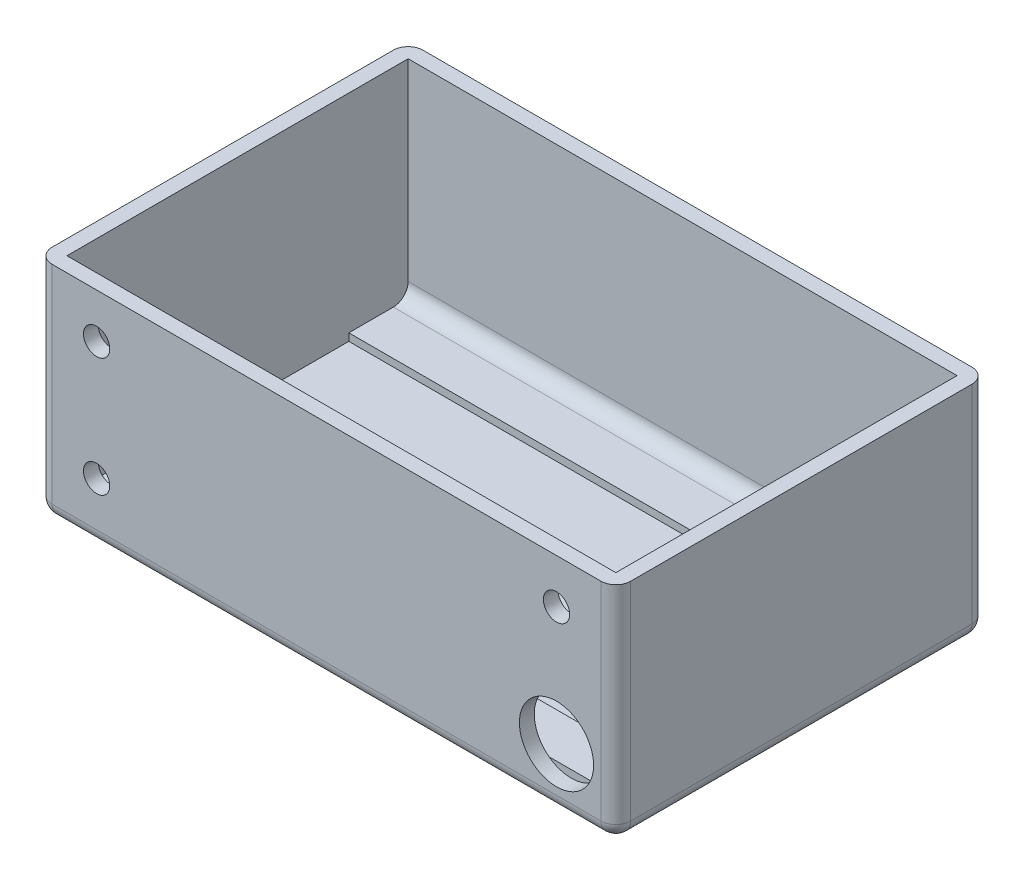
ISO-10303-21;
HEADER;
FILE_DESCRIPTION(('STEP AP214'),'2;1');
FILE_NAME('part.step','',(''),(''),'','','');
FILE_SCHEMA(('AUTOMOTIVE_DESIGN { 1 0 10303 214 1 1 1 1 }'));
ENDSEC;
DATA;
#1=APPLICATION_CONTEXT('core data for automotive mechanical design processes');
#2=APPLICATION_PROTOCOL_DEFINITION('international standard','automotive_design',2000,#1);
#3=PRODUCT_CONTEXT('',#1,'mechanical');
#4=PRODUCT('Part','Part','',(#3));
#5=PRODUCT_RELATED_PRODUCT_CATEGORY('part','',(#4));
#6=PRODUCT_DEFINITION_FORMATION('','',#4);
#7=PRODUCT_DEFINITION_CONTEXT('part definition',#1,'design');
#8=PRODUCT_DEFINITION('design','',#6,#7);
#9=PRODUCT_DEFINITION_SHAPE('','',#8);
#10=(LENGTH_UNIT() NAMED_UNIT(*) SI_UNIT(.MILLI.,.METRE.));
#11=(NAMED_UNIT(*) PLANE_ANGLE_UNIT() SI_UNIT($,.RADIAN.));
#12=(NAMED_UNIT(*) SI_UNIT($,.STERADIAN.) SOLID_ANGLE_UNIT());
#13=UNCERTAINTY_MEASURE_WITH_UNIT(LENGTH_MEASURE(1.E-05),#10,'distance_accuracy_value','');
#14=(GEOMETRIC_REPRESENTATION_CONTEXT(3) GLOBAL_UNCERTAINTY_ASSIGNED_CONTEXT((#13)) GLOBAL_UNIT_ASSIGNED_CONTEXT((#10,
#11,#12)) REPRESENTATION_CONTEXT('',''));
#15=CARTESIAN_POINT('',(0.,0.,0.));
#16=DIRECTION('',(0.,0.,1.));
#17=DIRECTION('',(1.,0.,0.));
#18=AXIS2_PLACEMENT_3D('',#15,#16,#17);
#19=CARTESIAN_POINT('',(48.26,38.1,29.21));
#20=DIRECTION('',(0.,0.,-1.));
#21=DIRECTION('',(0.,1.,0.));
#22=AXIS2_PLACEMENT_3D('',#19,#20,#21);
#23=PLANE('',#22);
#24=CARTESIAN_POINT('',(40.64,30.48,29.21));
#25=DIRECTION('',(0.,0.,-1.));
#26=DIRECTION('',(0.,1.,0.));
#27=AXIS2_PLACEMENT_3D('',#24,#25,#26);
#28=CIRCLE('',#27,2.25);
#29=CARTESIAN_POINT('',(40.64,32.73,29.21));
#30=VERTEX_POINT('',#29);
#31=EDGE_CURVE('E623',#30,#30,#28,.T.);
#32=ORIENTED_EDGE('',*,*,#31,.F.);
#33=EDGE_LOOP('',(#32));
#34=FACE_BOUND('',#33,.T.);
#35=CARTESIAN_POINT('',(-38.1,30.48,29.21));
#36=DIRECTION('',(0.,0.,-1.));
#37=DIRECTION('',(0.,1.,0.));
#38=AXIS2_PLACEMENT_3D('',#35,#36,#37);
#39=CIRCLE('',#38,2.25);
#40=CARTESIAN_POINT('',(-38.1,32.73,29.21));
#41=VERTEX_POINT('',#40);
#42=EDGE_CURVE('E615',#41,#41,#39,.T.);
#43=ORIENTED_EDGE('',*,*,#42,.F.);
#44=EDGE_LOOP('',(#43));
#45=FACE_BOUND('',#44,.T.);
#46=CARTESIAN_POINT('',(-38.1,10.16,29.21));
#47=DIRECTION('',(0.,0.,-1.));
#48=DIRECTION('',(0.,1.,0.));
#49=AXIS2_PLACEMENT_3D('',#46,#47,#48);
#50=CIRCLE('',#49,2.25);
#51=CARTESIAN_POINT('',(-38.1,12.41,29.21));
#52=VERTEX_POINT('',#51);
#53=EDGE_CURVE('E607',#52,#52,#50,.T.);
#54=ORIENTED_EDGE('',*,*,#53,.F.);
#55=EDGE_LOOP('',(#54));
#56=FACE_BOUND('',#55,.T.);
#57=CARTESIAN_POINT('',(40.64,10.16,29.21));
#58=DIRECTION('',(0.,0.,-1.));
#59=DIRECTION('',(0.,1.,0.));
#60=AXIS2_PLACEMENT_3D('',#57,#58,#59);
#61=CIRCLE('',#60,6.35);
#62=CARTESIAN_POINT('',(36.83,5.07999999999999,29.21));
#63=VERTEX_POINT('',#62);
#64=CARTESIAN_POINT('',(44.45,5.07999999999999,29.21));
#65=VERTEX_POINT('',#64);
#66=EDGE_CURVE('E251',#63,#65,#61,.T.);
#67=ORIENTED_EDGE('',*,*,#66,.F.);
#68=DIRECTION('',(-1.,0.,0.));
#69=VECTOR('',#68,1.);
#70=CARTESIAN_POINT('',(-48.26,5.07999999999999,29.21));
#71=LINE('',#70,#69);
#72=CARTESIAN_POINT('',(-45.72,5.08000000000001,29.21));
#73=VERTEX_POINT('',#72);
#74=EDGE_CURVE('E245',#63,#73,#71,.T.);
#75=ORIENTED_EDGE('',*,*,#74,.T.);
#76=DIRECTION('',(0.,-1.,0.));
#77=VECTOR('',#76,1.);
#78=CARTESIAN_POINT('',(-45.72,38.1,29.21));
#79=LINE('',#78,#77);
#80=CARTESIAN_POINT('',(-45.72,38.1,29.21));
#81=VERTEX_POINT('',#80);
#82=EDGE_CURVE('E484',#81,#73,#79,.T.);
#83=ORIENTED_EDGE('',*,*,#82,.F.);
#84=DIRECTION('',(-1.,0.,0.));
#85=VECTOR('',#84,1.);
#86=CARTESIAN_POINT('',(48.26,38.1,29.21));
#87=LINE('',#86,#85);
#88=CARTESIAN_POINT('',(48.26,38.1,29.21));
#89=VERTEX_POINT('',#88);
#90=EDGE_CURVE('E421',#89,#81,#87,.T.);
#91=ORIENTED_EDGE('',*,*,#90,.F.);
#92=DIRECTION('',(0.,-1.,0.));
#93=VECTOR('',#92,1.);
#94=CARTESIAN_POINT('',(48.26,38.1,29.21));
#95=LINE('',#94,#93);
#96=CARTESIAN_POINT('',(48.26,5.08000000000001,29.21));
#97=VERTEX_POINT('',#96);
#98=EDGE_CURVE('E407',#89,#97,#95,.T.);
#99=ORIENTED_EDGE('',*,*,#98,.T.);
#100=EDGE_CURVE('E244',#97,#65,#71,.T.);
#101=ORIENTED_EDGE('',*,*,#100,.T.);
#102=EDGE_LOOP('',(#67,#75,#83,#91,#99,#101));
#103=FACE_BOUND('',#102,.T.);
#104=ADVANCED_FACE('F45',(#34,#45,#56,#103),#23,.T.);
#105=CARTESIAN_POINT('',(48.26,38.1,31.75));
#106=DIRECTION('',(0.,1.,0.));
#107=DIRECTION('',(0.,0.,1.));
#108=AXIS2_PLACEMENT_3D('',#105,#106,#107);
#109=PLANE('',#108);
#110=DIRECTION('',(-1.,0.,0.));
#111=VECTOR('',#110,1.);
#112=CARTESIAN_POINT('',(48.26,38.1,-29.21));
#113=LINE('',#112,#111);
#114=CARTESIAN_POINT('',(48.26,38.1,-29.21));
#115=VERTEX_POINT('',#114);
#116=CARTESIAN_POINT('',(-45.72,38.1,-29.21));
#117=VERTEX_POINT('',#116);
#118=EDGE_CURVE('E431',#115,#117,#113,.T.);
#119=ORIENTED_EDGE('',*,*,#118,.F.);
#120=DIRECTION('',(0.,0.,1.));
#121=VECTOR('',#120,1.);
#122=CARTESIAN_POINT('',(48.26,38.1,0.));
#123=LINE('',#122,#121);
#124=EDGE_CURVE('E522',#115,#89,#123,.T.);
#125=ORIENTED_EDGE('',*,*,#124,.T.);
#126=ORIENTED_EDGE('',*,*,#90,.T.);
#127=DIRECTION('',(0.,0.,-1.));
#128=VECTOR('',#127,1.);
#129=CARTESIAN_POINT('',(-45.72,38.1,0.));
#130=LINE('',#129,#128);
#131=EDGE_CURVE('E528',#81,#117,#130,.T.);
#132=ORIENTED_EDGE('',*,*,#131,.T.);
#133=EDGE_LOOP('',(#119,#125,#126,#132));
#134=FACE_BOUND('',#133,.T.);
#135=DIRECTION('',(-1.,0.,0.));
#136=VECTOR('',#135,1.);
#137=CARTESIAN_POINT('',(48.26,38.1,31.75));
#138=LINE('',#137,#136);
#139=CARTESIAN_POINT('',(48.26,38.1,31.75));
#140=VERTEX_POINT('',#139);
#141=CARTESIAN_POINT('',(-45.72,38.1,31.75));
#142=VERTEX_POINT('',#141);
#143=EDGE_CURVE('E425',#140,#142,#138,.T.);
#144=ORIENTED_EDGE('',*,*,#143,.F.);
#145=CARTESIAN_POINT('',(48.26,38.1,29.21));
#146=DIRECTION('',(0.,1.,0.));
#147=DIRECTION('',(0.,0.,1.));
#148=AXIS2_PLACEMENT_3D('',#145,#146,#147);
#149=CIRCLE('',#148,2.54);
#150=CARTESIAN_POINT('',(50.8,38.1,29.21));
#151=VERTEX_POINT('',#150);
#152=EDGE_CURVE('E354',#140,#151,#149,.T.);
#153=ORIENTED_EDGE('',*,*,#152,.T.);
#154=DIRECTION('',(0.,0.,1.));
#155=VECTOR('',#154,1.);
#156=CARTESIAN_POINT('',(50.8,38.1,0.));
#157=LINE('',#156,#155);
#158=CARTESIAN_POINT('',(50.8,38.1,-29.21));
#159=VERTEX_POINT('',#158);
#160=EDGE_CURVE('E532',#159,#151,#157,.T.);
#161=ORIENTED_EDGE('',*,*,#160,.F.);
#162=CARTESIAN_POINT('',(48.26,38.1,-29.21));
#163=DIRECTION('',(0.,1.,0.));
#164=DIRECTION('',(0.,0.,1.));
#165=AXIS2_PLACEMENT_3D('',#162,#163,#164);
#166=CIRCLE('',#165,2.54);
#167=CARTESIAN_POINT('',(48.26,38.1,-31.75));
#168=VERTEX_POINT('',#167);
#169=EDGE_CURVE('E69',#159,#168,#166,.T.);
#170=ORIENTED_EDGE('',*,*,#169,.T.);
#171=DIRECTION('',(-1.,0.,0.));
#172=VECTOR('',#171,1.);
#173=CARTESIAN_POINT('',(48.26,38.1,-31.75));
#174=LINE('',#173,#172);
#175=CARTESIAN_POINT('',(-45.72,38.1,-31.75));
#176=VERTEX_POINT('',#175);
#177=EDGE_CURVE('E402',#168,#176,#174,.T.);
#178=ORIENTED_EDGE('',*,*,#177,.T.);
#179=CARTESIAN_POINT('',(-45.72,38.1,-29.21));
#180=DIRECTION('',(0.,1.,0.));
#181=DIRECTION('',(0.,0.,1.));
#182=AXIS2_PLACEMENT_3D('',#179,#180,#181);
#183=CIRCLE('',#182,2.54);
#184=CARTESIAN_POINT('',(-48.26,38.1,-29.21));
#185=VERTEX_POINT('',#184);
#186=EDGE_CURVE('E346',#176,#185,#183,.T.);
#187=ORIENTED_EDGE('',*,*,#186,.T.);
#188=DIRECTION('',(0.,0.,-1.));
#189=VECTOR('',#188,1.);
#190=CARTESIAN_POINT('',(-48.26,38.1,31.75));
#191=LINE('',#190,#189);
#192=CARTESIAN_POINT('',(-48.26,38.1,29.21));
#193=VERTEX_POINT('',#192);
#194=EDGE_CURVE('E400',#193,#185,#191,.T.);
#195=ORIENTED_EDGE('',*,*,#194,.F.);
#196=CARTESIAN_POINT('',(-45.72,38.1,29.21));
#197=DIRECTION('',(0.,1.,0.));
#198=DIRECTION('',(0.,0.,1.));
#199=AXIS2_PLACEMENT_3D('',#196,#197,#198);
#200=CIRCLE('',#199,2.54);
#201=EDGE_CURVE('E349',#193,#142,#200,.T.);
#202=ORIENTED_EDGE('',*,*,#201,.T.);
#203=EDGE_LOOP('',(#144,#153,#161,#170,#178,#187,#195,#202));
#204=FACE_BOUND('',#203,.T.);
#205=ADVANCED_FACE('F399',(#134,#204),#109,.T.);
#206=CARTESIAN_POINT('',(48.26,0.,31.75));
#207=DIRECTION('',(0.,0.,1.));
#208=DIRECTION('',(1.,0.,0.));
#209=AXIS2_PLACEMENT_3D('',#206,#207,#208);
#210=PLANE('',#209);
#211=CARTESIAN_POINT('',(40.64,30.48,31.75));
#212=DIRECTION('',(0.,0.,-1.));
#213=DIRECTION('',(0.,1.,0.));
#214=AXIS2_PLACEMENT_3D('',#211,#212,#213);
#215=CIRCLE('',#214,2.25);
#216=CARTESIAN_POINT('',(40.64,32.73,31.75));
#217=VERTEX_POINT('',#216);
#218=EDGE_CURVE('E619',#217,#217,#215,.T.);
#219=ORIENTED_EDGE('',*,*,#218,.T.);
#220=EDGE_LOOP('',(#219));
#221=FACE_BOUND('',#220,.T.);
#222=CARTESIAN_POINT('',(-38.1,30.48,31.75));
#223=DIRECTION('',(0.,0.,-1.));
#224=DIRECTION('',(0.,1.,0.));
#225=AXIS2_PLACEMENT_3D('',#222,#223,#224);
#226=CIRCLE('',#225,2.25);
#227=CARTESIAN_POINT('',(-38.1,32.73,31.75));
#228=VERTEX_POINT('',#227);
#229=EDGE_CURVE('E611',#228,#228,#226,.T.);
#230=ORIENTED_EDGE('',*,*,#229,.T.);
#231=EDGE_LOOP('',(#230));
#232=FACE_BOUND('',#231,.T.);
#233=CARTESIAN_POINT('',(-38.1,10.16,31.75));
#234=DIRECTION('',(0.,0.,-1.));
#235=DIRECTION('',(0.,1.,0.));
#236=AXIS2_PLACEMENT_3D('',#233,#234,#235);
#237=CIRCLE('',#236,2.25);
#238=CARTESIAN_POINT('',(-38.1,12.41,31.75));
#239=VERTEX_POINT('',#238);
#240=EDGE_CURVE('E378',#239,#239,#237,.T.);
#241=ORIENTED_EDGE('',*,*,#240,.T.);
#242=EDGE_LOOP('',(#241));
#243=FACE_BOUND('',#242,.T.);
#244=CARTESIAN_POINT('',(40.64,10.16,31.75));
#245=DIRECTION('',(0.,0.,1.));
#246=DIRECTION('',(1.,0.,0.));
#247=AXIS2_PLACEMENT_3D('',#244,#245,#246);
#248=CIRCLE('',#247,6.35);
#249=CARTESIAN_POINT('',(46.99,10.16,31.75));
#250=VERTEX_POINT('',#249);
#251=EDGE_CURVE('E253',#250,#250,#248,.F.);
#252=ORIENTED_EDGE('',*,*,#251,.T.);
#253=EDGE_LOOP('',(#252));
#254=FACE_BOUND('',#253,.T.);
#255=DIRECTION('',(-1.,0.,0.));
#256=VECTOR('',#255,1.);
#257=CARTESIAN_POINT('',(48.26,2.53999999999999,31.75));
#258=LINE('',#257,#256);
#259=CARTESIAN_POINT('',(-45.72,2.53999999999999,31.75));
#260=VERTEX_POINT('',#259);
#261=CARTESIAN_POINT('',(48.26,2.53999999999999,31.75));
#262=VERTEX_POINT('',#261);
#263=EDGE_CURVE('E292',#260,#262,#258,.F.);
#264=ORIENTED_EDGE('',*,*,#263,.T.);
#265=DIRECTION('',(0.,1.,0.));
#266=VECTOR('',#265,1.);
#267=CARTESIAN_POINT('',(48.26,0.,31.75));
#268=LINE('',#267,#266);
#269=EDGE_CURVE('E343',#262,#140,#268,.T.);
#270=ORIENTED_EDGE('',*,*,#269,.T.);
#271=ORIENTED_EDGE('',*,*,#143,.T.);
#272=DIRECTION('',(0.,1.,0.));
#273=VECTOR('',#272,1.);
#274=CARTESIAN_POINT('',(-45.72,2.53999999999999,31.75));
#275=LINE('',#274,#273);
#276=EDGE_CURVE('E340',#142,#260,#275,.F.);
#277=ORIENTED_EDGE('',*,*,#276,.T.);
#278=EDGE_LOOP('',(#264,#270,#271,#277));
#279=FACE_BOUND('',#278,.T.);
#280=ADVANCED_FACE('F673',(#221,#232,#243,#254,#279),#210,.T.);
#281=CARTESIAN_POINT('',(48.26,0.,-31.75));
#282=DIRECTION('',(0.,-1.,0.));
#283=DIRECTION('',(0.,0.,-1.));
#284=AXIS2_PLACEMENT_3D('',#281,#282,#283);
#285=PLANE('',#284);
#286=DIRECTION('',(-1.,0.,0.));
#287=VECTOR('',#286,1.);
#288=CARTESIAN_POINT('',(48.26,0.,-29.21));
#289=LINE('',#288,#287);
#290=CARTESIAN_POINT('',(-45.72,0.,-29.21));
#291=VERTEX_POINT('',#290);
#292=CARTESIAN_POINT('',(48.26,0.,-29.21));
#293=VERTEX_POINT('',#292);
#294=EDGE_CURVE('E288',#291,#293,#289,.F.);
#295=ORIENTED_EDGE('',*,*,#294,.T.);
#296=DIRECTION('',(0.,0.,-1.));
#297=VECTOR('',#296,1.);
#298=CARTESIAN_POINT('',(48.26,0.,-31.75));
#299=LINE('',#298,#297);
#300=CARTESIAN_POINT('',(48.26,0.,29.21));
#301=VERTEX_POINT('',#300);
#302=EDGE_CURVE('E322',#293,#301,#299,.F.);
#303=ORIENTED_EDGE('',*,*,#302,.T.);
#304=DIRECTION('',(-1.,0.,0.));
#305=VECTOR('',#304,1.);
#306=CARTESIAN_POINT('',(48.26,0.,29.21));
#307=LINE('',#306,#305);
#308=CARTESIAN_POINT('',(-45.72,0.,29.21));
#309=VERTEX_POINT('',#308);
#310=EDGE_CURVE('E282',#301,#309,#307,.T.);
#311=ORIENTED_EDGE('',*,*,#310,.T.);
#312=DIRECTION('',(0.,0.,1.));
#313=VECTOR('',#312,1.);
#314=CARTESIAN_POINT('',(-45.72,0.,-29.21));
#315=LINE('',#314,#313);
#316=EDGE_CURVE('E319',#309,#291,#315,.F.);
#317=ORIENTED_EDGE('',*,*,#316,.T.);
#318=EDGE_LOOP('',(#295,#303,#311,#317));
#319=FACE_BOUND('',#318,.T.);
#320=ADVANCED_FACE('F676',(#319),#285,.T.);
#321=CARTESIAN_POINT('',(48.26,0.,-31.75));
#322=DIRECTION('',(0.,0.,1.));
#323=DIRECTION('',(0.,-1.,0.));
#324=AXIS2_PLACEMENT_3D('',#321,#322,#323);
#325=PLANE('',#324);
#326=ORIENTED_EDGE('',*,*,#177,.F.);
#327=DIRECTION('',(0.,1.,0.));
#328=VECTOR('',#327,1.);
#329=CARTESIAN_POINT('',(48.26,2.54,-31.75));
#330=LINE('',#329,#328);
#331=CARTESIAN_POINT('',(48.26,2.54,-31.75));
#332=VERTEX_POINT('',#331);
#333=EDGE_CURVE('E11',#168,#332,#330,.F.);
#334=ORIENTED_EDGE('',*,*,#333,.T.);
#335=DIRECTION('',(-1.,0.,0.));
#336=VECTOR('',#335,1.);
#337=CARTESIAN_POINT('',(-48.26,2.54,-31.75));
#338=LINE('',#337,#336);
#339=CARTESIAN_POINT('',(-45.72,2.54,-31.75));
#340=VERTEX_POINT('',#339);
#341=EDGE_CURVE('E276',#332,#340,#338,.T.);
#342=ORIENTED_EDGE('',*,*,#341,.T.);
#343=DIRECTION('',(0.,1.,0.));
#344=VECTOR('',#343,1.);
#345=CARTESIAN_POINT('',(-45.72,0.,-31.75));
#346=LINE('',#345,#344);
#347=EDGE_CURVE('E55',#340,#176,#346,.T.);
#348=ORIENTED_EDGE('',*,*,#347,.T.);
#349=EDGE_LOOP('',(#326,#334,#342,#348));
#350=FACE_BOUND('',#349,.T.);
#351=ADVANCED_FACE('F680',(#350),#325,.F.);
#352=CARTESIAN_POINT('',(48.26,38.1,-29.21));
#353=DIRECTION('',(0.,0.,-1.));
#354=DIRECTION('',(0.,1.,0.));
#355=AXIS2_PLACEMENT_3D('',#352,#353,#354);
#356=PLANE('',#355);
#357=ORIENTED_EDGE('',*,*,#118,.T.);
#358=DIRECTION('',(0.,-1.,0.));
#359=VECTOR('',#358,1.);
#360=CARTESIAN_POINT('',(-45.72,38.1,-29.21));
#361=LINE('',#360,#359);
#362=CARTESIAN_POINT('',(-45.72,5.08,-29.21));
#363=VERTEX_POINT('',#362);
#364=EDGE_CURVE('E408',#117,#363,#361,.T.);
#365=ORIENTED_EDGE('',*,*,#364,.T.);
#366=DIRECTION('',(-1.,0.,0.));
#367=VECTOR('',#366,1.);
#368=CARTESIAN_POINT('',(48.26,5.08,-29.21));
#369=LINE('',#368,#367);
#370=CARTESIAN_POINT('',(48.26,5.08000000000002,-29.21));
#371=VERTEX_POINT('',#370);
#372=EDGE_CURVE('E266',#363,#371,#369,.F.);
#373=ORIENTED_EDGE('',*,*,#372,.T.);
#374=DIRECTION('',(0.,-1.,0.));
#375=VECTOR('',#374,1.);
#376=CARTESIAN_POINT('',(48.26,38.1,-29.21));
#377=LINE('',#376,#375);
#378=EDGE_CURVE('E419',#115,#371,#377,.T.);
#379=ORIENTED_EDGE('',*,*,#378,.F.);
#380=EDGE_LOOP('',(#357,#365,#373,#379));
#381=FACE_BOUND('',#380,.T.);
#382=ADVANCED_FACE('F525',(#381),#356,.F.);
#383=CARTESIAN_POINT('',(48.26,2.54,-29.21));
#384=DIRECTION('',(0.,-1.,0.));
#385=DIRECTION('',(0.,0.,-1.));
#386=AXIS2_PLACEMENT_3D('',#383,#384,#385);
#387=PLANE('',#386);
#388=DIRECTION('',(-1.,0.,0.));
#389=VECTOR('',#388,1.);
#390=CARTESIAN_POINT('',(-48.26,2.54,-26.67));
#391=LINE('',#390,#389);
#392=CARTESIAN_POINT('',(48.26,2.54,-26.67));
#393=VERTEX_POINT('',#392);
#394=CARTESIAN_POINT('',(-45.72,2.54,-26.67));
#395=VERTEX_POINT('',#394);
#396=EDGE_CURVE('E269',#393,#395,#391,.T.);
#397=ORIENTED_EDGE('',*,*,#396,.T.);
#398=DIRECTION('',(0.,0.,1.));
#399=VECTOR('',#398,1.);
#400=CARTESIAN_POINT('',(-45.72,2.54,-29.21));
#401=LINE('',#400,#399);
#402=CARTESIAN_POINT('',(-45.72,2.54,-19.05));
#403=VERTEX_POINT('',#402);
#404=EDGE_CURVE('E475',#395,#403,#401,.T.);
#405=ORIENTED_EDGE('',*,*,#404,.T.);
#406=DIRECTION('',(-1.,0.,0.));
#407=VECTOR('',#406,1.);
#408=CARTESIAN_POINT('',(48.26,2.54,-19.05));
#409=LINE('',#408,#407);
#410=CARTESIAN_POINT('',(48.26,2.54,-19.05));
#411=VERTEX_POINT('',#410);
#412=EDGE_CURVE('E435',#411,#403,#409,.T.);
#413=ORIENTED_EDGE('',*,*,#412,.F.);
#414=DIRECTION('',(0.,0.,1.));
#415=VECTOR('',#414,1.);
#416=CARTESIAN_POINT('',(48.26,2.54,-29.21));
#417=LINE('',#416,#415);
#418=EDGE_CURVE('E476',#393,#411,#417,.T.);
#419=ORIENTED_EDGE('',*,*,#418,.F.);
#420=EDGE_LOOP('',(#397,#405,#413,#419));
#421=FACE_BOUND('',#420,.T.);
#422=ADVANCED_FACE('F473',(#421),#387,.F.);
#423=CARTESIAN_POINT('',(48.26,2.54,-19.05));
#424=DIRECTION('',(0.,0.,-1.));
#425=DIRECTION('',(-1.,0.,0.));
#426=AXIS2_PLACEMENT_3D('',#423,#424,#425);
#427=PLANE('',#426);
#428=ORIENTED_EDGE('',*,*,#412,.T.);
#429=DIRECTION('',(0.,-1.,0.));
#430=VECTOR('',#429,1.);
#431=CARTESIAN_POINT('',(-45.72,2.54,-19.05));
#432=LINE('',#431,#430);
#433=CARTESIAN_POINT('',(-45.72,1.27,-19.05));
#434=VERTEX_POINT('',#433);
#435=EDGE_CURVE('E564',#403,#434,#432,.T.);
#436=ORIENTED_EDGE('',*,*,#435,.T.);
#437=DIRECTION('',(-1.,0.,0.));
#438=VECTOR('',#437,1.);
#439=CARTESIAN_POINT('',(48.26,1.27,-19.05));
#440=LINE('',#439,#438);
#441=CARTESIAN_POINT('',(48.26,1.27,-19.05));
#442=VERTEX_POINT('',#441);
#443=EDGE_CURVE('E439',#442,#434,#440,.T.);
#444=ORIENTED_EDGE('',*,*,#443,.F.);
#445=DIRECTION('',(0.,-1.,0.));
#446=VECTOR('',#445,1.);
#447=CARTESIAN_POINT('',(48.26,2.54,-19.05));
#448=LINE('',#447,#446);
#449=EDGE_CURVE('E514',#411,#442,#448,.T.);
#450=ORIENTED_EDGE('',*,*,#449,.F.);
#451=EDGE_LOOP('',(#428,#436,#444,#450));
#452=FACE_BOUND('',#451,.T.);
#453=ADVANCED_FACE('F570',(#452),#427,.F.);
#454=CARTESIAN_POINT('',(48.26,1.27,-19.05));
#455=DIRECTION('',(0.,-1.,0.));
#456=DIRECTION('',(0.,0.,-1.));
#457=AXIS2_PLACEMENT_3D('',#454,#455,#456);
#458=PLANE('',#457);
#459=ORIENTED_EDGE('',*,*,#443,.T.);
#460=DIRECTION('',(0.,0.,1.));
#461=VECTOR('',#460,1.);
#462=CARTESIAN_POINT('',(-45.72,1.27,-19.05));
#463=LINE('',#462,#461);
#464=CARTESIAN_POINT('',(-45.72,1.26999999999999,-6.35));
#465=VERTEX_POINT('',#464);
#466=EDGE_CURVE('E560',#434,#465,#463,.T.);
#467=ORIENTED_EDGE('',*,*,#466,.T.);
#468=DIRECTION('',(-1.,0.,0.));
#469=VECTOR('',#468,1.);
#470=CARTESIAN_POINT('',(48.26,1.26999999999999,-6.35));
#471=LINE('',#470,#469);
#472=CARTESIAN_POINT('',(48.26,1.26999999999999,-6.35));
#473=VERTEX_POINT('',#472);
#474=EDGE_CURVE('E443',#473,#465,#471,.T.);
#475=ORIENTED_EDGE('',*,*,#474,.F.);
#476=DIRECTION('',(0.,0.,1.));
#477=VECTOR('',#476,1.);
#478=CARTESIAN_POINT('',(48.26,1.27,-19.05));
#479=LINE('',#478,#477);
#480=EDGE_CURVE('E511',#442,#473,#479,.T.);
#481=ORIENTED_EDGE('',*,*,#480,.F.);
#482=EDGE_LOOP('',(#459,#467,#475,#481));
#483=FACE_BOUND('',#482,.T.);
#484=ADVANCED_FACE('F574',(#483),#458,.F.);
#485=CARTESIAN_POINT('',(48.26,1.26999999999999,-6.35));
#486=DIRECTION('',(0.,0.,1.));
#487=DIRECTION('',(0.,-1.,0.));
#488=AXIS2_PLACEMENT_3D('',#485,#486,#487);
#489=PLANE('',#488);
#490=ORIENTED_EDGE('',*,*,#474,.T.);
#491=DIRECTION('',(0.,1.,0.));
#492=VECTOR('',#491,1.);
#493=CARTESIAN_POINT('',(-45.72,1.26999999999999,-6.35));
#494=LINE('',#493,#492);
#495=CARTESIAN_POINT('',(-45.72,2.54,-6.35));
#496=VERTEX_POINT('',#495);
#497=EDGE_CURVE('E556',#465,#496,#494,.T.);
#498=ORIENTED_EDGE('',*,*,#497,.T.);
#499=DIRECTION('',(-1.,0.,0.));
#500=VECTOR('',#499,1.);
#501=CARTESIAN_POINT('',(48.26,2.54,-6.35));
#502=LINE('',#501,#500);
#503=CARTESIAN_POINT('',(48.26,2.54,-6.35));
#504=VERTEX_POINT('',#503);
#505=EDGE_CURVE('E447',#504,#496,#502,.T.);
#506=ORIENTED_EDGE('',*,*,#505,.F.);
#507=DIRECTION('',(0.,1.,0.));
#508=VECTOR('',#507,1.);
#509=CARTESIAN_POINT('',(48.26,1.26999999999999,-6.35));
#510=LINE('',#509,#508);
#511=EDGE_CURVE('E508',#473,#504,#510,.T.);
#512=ORIENTED_EDGE('',*,*,#511,.F.);
#513=EDGE_LOOP('',(#490,#498,#506,#512));
#514=FACE_BOUND('',#513,.T.);
#515=ADVANCED_FACE('F580',(#514),#489,.F.);
#516=CARTESIAN_POINT('',(48.26,2.53999999999999,6.35));
#517=DIRECTION('',(0.,1.,0.));
#518=DIRECTION('',(0.,0.,1.));
#519=AXIS2_PLACEMENT_3D('',#516,#517,#518);
#520=PLANE('',#519);
#521=DIRECTION('',(0.,0.,-1.));
#522=VECTOR('',#521,1.);
#523=CARTESIAN_POINT('',(-45.72,2.53999999999999,6.35));
#524=LINE('',#523,#522);
#525=CARTESIAN_POINT('',(-45.72,2.53999999999999,6.35));
#526=VERTEX_POINT('',#525);
#527=EDGE_CURVE('E553',#526,#496,#524,.T.);
#528=ORIENTED_EDGE('',*,*,#527,.F.);
#529=DIRECTION('',(-1.,0.,0.));
#530=VECTOR('',#529,1.);
#531=CARTESIAN_POINT('',(48.26,2.53999999999999,6.35));
#532=LINE('',#531,#530);
#533=CARTESIAN_POINT('',(48.26,2.53999999999999,6.35));
#534=VERTEX_POINT('',#533);
#535=EDGE_CURVE('E451',#534,#526,#532,.T.);
#536=ORIENTED_EDGE('',*,*,#535,.F.);
#537=DIRECTION('',(0.,0.,-1.));
#538=VECTOR('',#537,1.);
#539=CARTESIAN_POINT('',(48.26,2.53999999999999,6.35));
#540=LINE('',#539,#538);
#541=EDGE_CURVE('E504',#534,#504,#540,.T.);
#542=ORIENTED_EDGE('',*,*,#541,.T.);
#543=ORIENTED_EDGE('',*,*,#505,.T.);
#544=EDGE_LOOP('',(#528,#536,#542,#543));
#545=FACE_BOUND('',#544,.T.);
#546=ADVANCED_FACE('F583',(#545),#520,.T.);
#547=CARTESIAN_POINT('',(48.26,1.26999999999999,6.35));
#548=DIRECTION('',(0.,0.,1.));
#549=DIRECTION('',(0.,-1.,0.));
#550=AXIS2_PLACEMENT_3D('',#547,#548,#549);
#551=PLANE('',#550);
#552=DIRECTION('',(0.,1.,0.));
#553=VECTOR('',#552,1.);
#554=CARTESIAN_POINT('',(-45.72,1.26999999999999,6.35));
#555=LINE('',#554,#553);
#556=CARTESIAN_POINT('',(-45.72,1.26999999999999,6.35));
#557=VERTEX_POINT('',#556);
#558=EDGE_CURVE('E550',#557,#526,#555,.T.);
#559=ORIENTED_EDGE('',*,*,#558,.F.);
#560=DIRECTION('',(-1.,0.,0.));
#561=VECTOR('',#560,1.);
#562=CARTESIAN_POINT('',(48.26,1.26999999999999,6.35));
#563=LINE('',#562,#561);
#564=CARTESIAN_POINT('',(48.26,1.26999999999999,6.35));
#565=VERTEX_POINT('',#564);
#566=EDGE_CURVE('E455',#565,#557,#563,.T.);
#567=ORIENTED_EDGE('',*,*,#566,.F.);
#568=DIRECTION('',(0.,1.,0.));
#569=VECTOR('',#568,1.);
#570=CARTESIAN_POINT('',(48.26,1.26999999999999,6.35));
#571=LINE('',#570,#569);
#572=EDGE_CURVE('E500',#565,#534,#571,.T.);
#573=ORIENTED_EDGE('',*,*,#572,.T.);
#574=ORIENTED_EDGE('',*,*,#535,.T.);
#575=EDGE_LOOP('',(#559,#567,#573,#574));
#576=FACE_BOUND('',#575,.T.);
#577=ADVANCED_FACE('F587',(#576),#551,.T.);
#578=CARTESIAN_POINT('',(48.26,1.26999999999999,19.05));
#579=DIRECTION('',(0.,1.,0.));
#580=DIRECTION('',(0.,0.,1.));
#581=AXIS2_PLACEMENT_3D('',#578,#579,#580);
#582=PLANE('',#581);
#583=DIRECTION('',(0.,0.,-1.));
#584=VECTOR('',#583,1.);
#585=CARTESIAN_POINT('',(-45.72,1.26999999999999,19.05));
#586=LINE('',#585,#584);
#587=CARTESIAN_POINT('',(-45.72,1.26999999999999,19.05));
#588=VERTEX_POINT('',#587);
#589=EDGE_CURVE('E547',#588,#557,#586,.T.);
#590=ORIENTED_EDGE('',*,*,#589,.F.);
#591=DIRECTION('',(-1.,0.,0.));
#592=VECTOR('',#591,1.);
#593=CARTESIAN_POINT('',(48.26,1.26999999999999,19.05));
#594=LINE('',#593,#592);
#595=CARTESIAN_POINT('',(48.26,1.26999999999999,19.05));
#596=VERTEX_POINT('',#595);
#597=EDGE_CURVE('E459',#596,#588,#594,.T.);
#598=ORIENTED_EDGE('',*,*,#597,.F.);
#599=DIRECTION('',(0.,0.,-1.));
#600=VECTOR('',#599,1.);
#601=CARTESIAN_POINT('',(48.26,1.26999999999999,19.05));
#602=LINE('',#601,#600);
#603=EDGE_CURVE('E496',#596,#565,#602,.T.);
#604=ORIENTED_EDGE('',*,*,#603,.T.);
#605=ORIENTED_EDGE('',*,*,#566,.T.);
#606=EDGE_LOOP('',(#590,#598,#604,#605));
#607=FACE_BOUND('',#606,.T.);
#608=ADVANCED_FACE('F591',(#607),#582,.T.);
#609=CARTESIAN_POINT('',(48.26,2.53999999999999,19.05));
#610=DIRECTION('',(0.,0.,-1.));
#611=DIRECTION('',(-1.,0.,0.));
#612=AXIS2_PLACEMENT_3D('',#609,#610,#611);
#613=PLANE('',#612);
#614=DIRECTION('',(0.,-1.,0.));
#615=VECTOR('',#614,1.);
#616=CARTESIAN_POINT('',(-45.72,2.53999999999999,19.05));
#617=LINE('',#616,#615);
#618=CARTESIAN_POINT('',(-45.72,2.53999999999999,19.05));
#619=VERTEX_POINT('',#618);
#620=EDGE_CURVE('E544',#619,#588,#617,.T.);
#621=ORIENTED_EDGE('',*,*,#620,.F.);
#622=DIRECTION('',(-1.,0.,0.));
#623=VECTOR('',#622,1.);
#624=CARTESIAN_POINT('',(48.26,2.53999999999999,19.05));
#625=LINE('',#624,#623);
#626=CARTESIAN_POINT('',(48.26,2.53999999999999,19.05));
#627=VERTEX_POINT('',#626);
#628=EDGE_CURVE('E463',#627,#619,#625,.T.);
#629=ORIENTED_EDGE('',*,*,#628,.F.);
#630=DIRECTION('',(0.,-1.,0.));
#631=VECTOR('',#630,1.);
#632=CARTESIAN_POINT('',(48.26,2.53999999999999,19.05));
#633=LINE('',#632,#631);
#634=EDGE_CURVE('E492',#627,#596,#633,.T.);
#635=ORIENTED_EDGE('',*,*,#634,.T.);
#636=ORIENTED_EDGE('',*,*,#597,.T.);
#637=EDGE_LOOP('',(#621,#629,#635,#636));
#638=FACE_BOUND('',#637,.T.);
#639=ADVANCED_FACE('F595',(#638),#613,.T.);
#640=CARTESIAN_POINT('',(48.26,2.53999999999999,29.21));
#641=DIRECTION('',(0.,1.,0.));
#642=DIRECTION('',(0.,0.,1.));
#643=AXIS2_PLACEMENT_3D('',#640,#641,#642);
#644=PLANE('',#643);
#645=DIRECTION('',(0.,0.,-1.));
#646=VECTOR('',#645,1.);
#647=CARTESIAN_POINT('',(-45.72,2.53999999999999,29.21));
#648=LINE('',#647,#646);
#649=CARTESIAN_POINT('',(-45.72,2.53999999999999,26.67));
#650=VERTEX_POINT('',#649);
#651=EDGE_CURVE('E536',#650,#619,#648,.T.);
#652=ORIENTED_EDGE('',*,*,#651,.F.);
#653=DIRECTION('',(-1.,0.,0.));
#654=VECTOR('',#653,1.);
#655=CARTESIAN_POINT('',(48.26,2.53999999999999,26.67));
#656=LINE('',#655,#654);
#657=CARTESIAN_POINT('',(48.26,2.53999999999999,26.67));
#658=VERTEX_POINT('',#657);
#659=EDGE_CURVE('E273',#650,#658,#656,.F.);
#660=ORIENTED_EDGE('',*,*,#659,.T.);
#661=DIRECTION('',(0.,0.,-1.));
#662=VECTOR('',#661,1.);
#663=CARTESIAN_POINT('',(48.26,2.53999999999999,29.21));
#664=LINE('',#663,#662);
#665=EDGE_CURVE('E412',#658,#627,#664,.T.);
#666=ORIENTED_EDGE('',*,*,#665,.T.);
#667=ORIENTED_EDGE('',*,*,#628,.T.);
#668=EDGE_LOOP('',(#652,#660,#666,#667));
#669=FACE_BOUND('',#668,.T.);
#670=ADVANCED_FACE('F596',(#669),#644,.T.);
#671=CARTESIAN_POINT('',(-48.26,0.,0.));
#672=DIRECTION('',(1.,0.,0.));
#673=DIRECTION('',(0.,0.,-1.));
#674=AXIS2_PLACEMENT_3D('',#671,#672,#673);
#675=PLANE('',#674);
#676=DIRECTION('',(0.,0.,1.));
#677=VECTOR('',#676,1.);
#678=CARTESIAN_POINT('',(-48.26,2.53999999999999,29.21));
#679=LINE('',#678,#677);
#680=CARTESIAN_POINT('',(-48.26,2.54,-29.21));
#681=VERTEX_POINT('',#680);
#682=CARTESIAN_POINT('',(-48.26,2.53999999999999,29.21));
#683=VERTEX_POINT('',#682);
#684=EDGE_CURVE('E334',#681,#683,#679,.T.);
#685=ORIENTED_EDGE('',*,*,#684,.T.);
#686=DIRECTION('',(0.,1.,0.));
#687=VECTOR('',#686,1.);
#688=CARTESIAN_POINT('',(-48.26,38.1,29.21));
#689=LINE('',#688,#687);
#690=EDGE_CURVE('E337',#683,#193,#689,.T.);
#691=ORIENTED_EDGE('',*,*,#690,.T.);
#692=ORIENTED_EDGE('',*,*,#194,.T.);
#693=DIRECTION('',(0.,1.,0.));
#694=VECTOR('',#693,1.);
#695=CARTESIAN_POINT('',(-48.26,0.,-29.21));
#696=LINE('',#695,#694);
#697=EDGE_CURVE('E331',#185,#681,#696,.F.);
#698=ORIENTED_EDGE('',*,*,#697,.T.);
#699=EDGE_LOOP('',(#685,#691,#692,#698));
#700=FACE_BOUND('',#699,.T.);
#701=ADVANCED_FACE('F404',(#700),#675,.F.);
#702=CARTESIAN_POINT('',(48.26,5.08,-26.67));
#703=DIRECTION('',(1.,0.,0.));
#704=DIRECTION('',(0.,0.,-1.));
#705=AXIS2_PLACEMENT_3D('',#702,#703,#704);
#706=CYLINDRICAL_SURFACE('',#705,2.54);
#707=ORIENTED_EDGE('',*,*,#372,.F.);
#708=CARTESIAN_POINT('',(-45.72,5.08,-26.67));
#709=DIRECTION('',(1.,0.,0.));
#710=DIRECTION('',(0.,0.,-1.));
#711=AXIS2_PLACEMENT_3D('',#708,#709,#710);
#712=CIRCLE('',#711,2.54);
#713=EDGE_CURVE('E415',#363,#395,#712,.F.);
#714=ORIENTED_EDGE('',*,*,#713,.T.);
#715=ORIENTED_EDGE('',*,*,#396,.F.);
#716=CARTESIAN_POINT('',(48.26,5.08,-26.67));
#717=DIRECTION('',(1.,0.,0.));
#718=DIRECTION('',(0.,0.,-1.));
#719=AXIS2_PLACEMENT_3D('',#716,#717,#718);
#720=CIRCLE('',#719,2.54);
#721=EDGE_CURVE('E296',#371,#393,#720,.F.);
#722=ORIENTED_EDGE('',*,*,#721,.F.);
#723=EDGE_LOOP('',(#707,#714,#715,#722));
#724=FACE_BOUND('',#723,.T.);
#725=ADVANCED_FACE('F481',(#724),#706,.F.);
#726=CARTESIAN_POINT('',(48.26,5.07999999999999,26.67));
#727=DIRECTION('',(1.,0.,0.));
#728=DIRECTION('',(0.,0.,-1.));
#729=AXIS2_PLACEMENT_3D('',#726,#727,#728);
#730=CYLINDRICAL_SURFACE('',#729,2.54);
#731=ORIENTED_EDGE('',*,*,#659,.F.);
#732=CARTESIAN_POINT('',(-45.72,5.07999999999999,26.67));
#733=DIRECTION('',(1.,0.,0.));
#734=DIRECTION('',(0.,0.,-1.));
#735=AXIS2_PLACEMENT_3D('',#732,#733,#734);
#736=CIRCLE('',#735,2.54);
#737=EDGE_CURVE('E264',#650,#73,#736,.F.);
#738=ORIENTED_EDGE('',*,*,#737,.T.);
#739=ORIENTED_EDGE('',*,*,#74,.F.);
#740=EDGE_CURVE('E234',#65,#63,#71,.T.);
#741=ORIENTED_EDGE('',*,*,#740,.F.);
#742=ORIENTED_EDGE('',*,*,#100,.F.);
#743=CARTESIAN_POINT('',(48.26,5.07999999999999,26.67));
#744=DIRECTION('',(1.,0.,0.));
#745=DIRECTION('',(0.,0.,-1.));
#746=AXIS2_PLACEMENT_3D('',#743,#744,#745);
#747=CIRCLE('',#746,2.54);
#748=EDGE_CURVE('E299',#658,#97,#747,.F.);
#749=ORIENTED_EDGE('',*,*,#748,.F.);
#750=EDGE_LOOP('',(#731,#738,#739,#741,#742,#749));
#751=FACE_BOUND('',#750,.T.);
#752=ADVANCED_FACE('F263',(#751),#730,.F.);
#753=CARTESIAN_POINT('',(48.26,2.54,-29.21));
#754=DIRECTION('',(1.,0.,0.));
#755=DIRECTION('',(0.,0.,-1.));
#756=AXIS2_PLACEMENT_3D('',#753,#754,#755);
#757=CYLINDRICAL_SURFACE('',#756,2.54);
#758=ORIENTED_EDGE('',*,*,#341,.F.);
#759=CARTESIAN_POINT('',(48.26,2.54,-29.21));
#760=DIRECTION('',(1.,0.,0.));
#761=DIRECTION('',(0.,0.,-1.));
#762=AXIS2_PLACEMENT_3D('',#759,#760,#761);
#763=CIRCLE('',#762,2.54);
#764=EDGE_CURVE('E328',#332,#293,#763,.F.);
#765=ORIENTED_EDGE('',*,*,#764,.T.);
#766=ORIENTED_EDGE('',*,*,#294,.F.);
#767=CARTESIAN_POINT('',(-45.72,2.54,-29.21));
#768=DIRECTION('',(1.,0.,0.));
#769=DIRECTION('',(0.,0.,-1.));
#770=AXIS2_PLACEMENT_3D('',#767,#768,#769);
#771=CIRCLE('',#770,2.54);
#772=EDGE_CURVE('E325',#291,#340,#771,.T.);
#773=ORIENTED_EDGE('',*,*,#772,.T.);
#774=EDGE_LOOP('',(#758,#765,#766,#773));
#775=FACE_BOUND('',#774,.T.);
#776=ADVANCED_FACE('F708',(#775),#757,.T.);
#777=CARTESIAN_POINT('',(48.26,2.53999999999999,29.21));
#778=DIRECTION('',(-1.,0.,0.));
#779=DIRECTION('',(0.,0.,1.));
#780=AXIS2_PLACEMENT_3D('',#777,#778,#779);
#781=CYLINDRICAL_SURFACE('',#780,2.54);
#782=ORIENTED_EDGE('',*,*,#310,.F.);
#783=CARTESIAN_POINT('',(48.26,2.53999999999999,29.21));
#784=DIRECTION('',(-1.,0.,0.));
#785=DIRECTION('',(0.,0.,1.));
#786=AXIS2_PLACEMENT_3D('',#783,#784,#785);
#787=CIRCLE('',#786,2.54);
#788=EDGE_CURVE('E306',#301,#262,#787,.T.);
#789=ORIENTED_EDGE('',*,*,#788,.T.);
#790=ORIENTED_EDGE('',*,*,#263,.F.);
#791=CARTESIAN_POINT('',(-45.72,2.53999999999999,29.21));
#792=DIRECTION('',(-1.,0.,0.));
#793=DIRECTION('',(0.,0.,1.));
#794=AXIS2_PLACEMENT_3D('',#791,#792,#793);
#795=CIRCLE('',#794,2.54);
#796=EDGE_CURVE('E302',#260,#309,#795,.F.);
#797=ORIENTED_EDGE('',*,*,#796,.T.);
#798=EDGE_LOOP('',(#782,#789,#790,#797));
#799=FACE_BOUND('',#798,.T.);
#800=ADVANCED_FACE('F668',(#799),#781,.T.);
#801=CARTESIAN_POINT('',(-45.72,2.54,-29.21));
#802=DIRECTION('',(1.,0.,0.));
#803=DIRECTION('',(0.,0.,-1.));
#804=AXIS2_PLACEMENT_3D('',#801,#802,#803);
#805=PLANE('',#804);
#806=ORIENTED_EDGE('',*,*,#364,.F.);
#807=ORIENTED_EDGE('',*,*,#131,.F.);
#808=ORIENTED_EDGE('',*,*,#82,.T.);
#809=ORIENTED_EDGE('',*,*,#737,.F.);
#810=ORIENTED_EDGE('',*,*,#651,.T.);
#811=ORIENTED_EDGE('',*,*,#620,.T.);
#812=ORIENTED_EDGE('',*,*,#589,.T.);
#813=ORIENTED_EDGE('',*,*,#558,.T.);
#814=ORIENTED_EDGE('',*,*,#527,.T.);
#815=ORIENTED_EDGE('',*,*,#497,.F.);
#816=ORIENTED_EDGE('',*,*,#466,.F.);
#817=ORIENTED_EDGE('',*,*,#435,.F.);
#818=ORIENTED_EDGE('',*,*,#404,.F.);
#819=ORIENTED_EDGE('',*,*,#713,.F.);
#820=EDGE_LOOP('',(#806,#807,#808,#809,#810,#811,#812,#813,#814,#815,#816,#817,#818,#819));
#821=FACE_BOUND('',#820,.T.);
#822=ADVANCED_FACE('F527',(#821),#805,.T.);
#823=CARTESIAN_POINT('',(48.26,2.54,-29.21));
#824=DIRECTION('',(1.,0.,0.));
#825=DIRECTION('',(0.,0.,-1.));
#826=AXIS2_PLACEMENT_3D('',#823,#824,#825);
#827=PLANE('',#826);
#828=ORIENTED_EDGE('',*,*,#124,.F.);
#829=ORIENTED_EDGE('',*,*,#378,.T.);
#830=ORIENTED_EDGE('',*,*,#721,.T.);
#831=ORIENTED_EDGE('',*,*,#418,.T.);
#832=ORIENTED_EDGE('',*,*,#449,.T.);
#833=ORIENTED_EDGE('',*,*,#480,.T.);
#834=ORIENTED_EDGE('',*,*,#511,.T.);
#835=ORIENTED_EDGE('',*,*,#541,.F.);
#836=ORIENTED_EDGE('',*,*,#572,.F.);
#837=ORIENTED_EDGE('',*,*,#603,.F.);
#838=ORIENTED_EDGE('',*,*,#634,.F.);
#839=ORIENTED_EDGE('',*,*,#665,.F.);
#840=ORIENTED_EDGE('',*,*,#748,.T.);
#841=ORIENTED_EDGE('',*,*,#98,.F.);
#842=EDGE_LOOP('',(#828,#829,#830,#831,#832,#833,#834,#835,#836,#837,#838,#839,#840,#841));
#843=FACE_BOUND('',#842,.T.);
#844=ADVANCED_FACE('F520',(#843),#827,.F.);
#845=CARTESIAN_POINT('',(50.8,2.54,-29.21));
#846=DIRECTION('',(1.,0.,0.));
#847=DIRECTION('',(0.,0.,-1.));
#848=AXIS2_PLACEMENT_3D('',#845,#846,#847);
#849=PLANE('',#848);
#850=ORIENTED_EDGE('',*,*,#160,.T.);
#851=DIRECTION('',(0.,1.,0.));
#852=VECTOR('',#851,1.);
#853=CARTESIAN_POINT('',(50.8,2.54,29.21));
#854=LINE('',#853,#852);
#855=CARTESIAN_POINT('',(50.8,2.53999999999999,29.21));
#856=VERTEX_POINT('',#855);
#857=EDGE_CURVE('E316',#151,#856,#854,.F.);
#858=ORIENTED_EDGE('',*,*,#857,.T.);
#859=DIRECTION('',(0.,0.,-1.));
#860=VECTOR('',#859,1.);
#861=CARTESIAN_POINT('',(50.8,2.54,-29.21));
#862=LINE('',#861,#860);
#863=CARTESIAN_POINT('',(50.8,2.54,-29.21));
#864=VERTEX_POINT('',#863);
#865=EDGE_CURVE('E313',#856,#864,#862,.T.);
#866=ORIENTED_EDGE('',*,*,#865,.T.);
#867=DIRECTION('',(0.,1.,0.));
#868=VECTOR('',#867,1.);
#869=CARTESIAN_POINT('',(50.8,38.1,-29.21));
#870=LINE('',#869,#868);
#871=EDGE_CURVE('E310',#864,#159,#870,.T.);
#872=ORIENTED_EDGE('',*,*,#871,.T.);
#873=EDGE_LOOP('',(#850,#858,#866,#872));
#874=FACE_BOUND('',#873,.T.);
#875=ADVANCED_FACE('F657',(#874),#849,.T.);
#876=CARTESIAN_POINT('',(40.64,10.16,29.21));
#877=DIRECTION('',(0.,0.,-1.));
#878=DIRECTION('',(0.,1.,0.));
#879=AXIS2_PLACEMENT_3D('',#876,#877,#878);
#880=PLANE('',#879);
#881=ORIENTED_EDGE('',*,*,#740,.T.);
#882=EDGE_CURVE('E237',#65,#63,#61,.T.);
#883=ORIENTED_EDGE('',*,*,#882,.F.);
#884=EDGE_LOOP('',(#881,#883));
#885=FACE_BOUND('',#884,.T.);
#886=ADVANCED_FACE('F236',(#885),#880,.F.);
#887=CARTESIAN_POINT('',(40.64,10.16,49.7105122421383));
#888=DIRECTION('',(0.,0.,-1.));
#889=DIRECTION('',(-1.,0.,0.));
#890=AXIS2_PLACEMENT_3D('',#887,#888,#889);
#891=CYLINDRICAL_SURFACE('',#890,6.35);
#892=ORIENTED_EDGE('',*,*,#882,.T.);
#893=ORIENTED_EDGE('',*,*,#66,.T.);
#894=EDGE_LOOP('',(#892,#893));
#895=FACE_BOUND('',#894,.T.);
#896=ORIENTED_EDGE('',*,*,#251,.F.);
#897=EDGE_LOOP('',(#896));
#898=FACE_BOUND('',#897,.T.);
#899=ADVANCED_FACE('F249',(#895,#898),#891,.F.);
#900=CARTESIAN_POINT('',(48.26,2.54,-29.21));
#901=DIRECTION('',(0.,-1.,0.));
#902=DIRECTION('',(0.,0.,-1.));
#903=AXIS2_PLACEMENT_3D('',#900,#901,#902);
#904=CYLINDRICAL_SURFACE('',#903,2.54);
#905=CARTESIAN_POINT('',(48.26,2.54,-29.21));
#906=DIRECTION('',(0.,-1.,0.));
#907=DIRECTION('',(0.,0.,-1.));
#908=AXIS2_PLACEMENT_3D('',#905,#906,#907);
#909=CIRCLE('',#908,2.54);
#910=EDGE_CURVE('E260',#332,#864,#909,.T.);
#911=ORIENTED_EDGE('',*,*,#910,.F.);
#912=ORIENTED_EDGE('',*,*,#333,.F.);
#913=ORIENTED_EDGE('',*,*,#169,.F.);
#914=ORIENTED_EDGE('',*,*,#871,.F.);
#915=EDGE_LOOP('',(#911,#912,#913,#914));
#916=FACE_BOUND('',#915,.T.);
#917=ADVANCED_FACE('F660',(#916),#904,.T.);
#918=CARTESIAN_POINT('',(48.26,2.54,-29.21));
#919=DIRECTION('',(1.,0.,0.));
#920=DIRECTION('',(0.,0.,-1.));
#921=AXIS2_PLACEMENT_3D('',#918,#919,#920);
#922=SPHERICAL_SURFACE('',#921,2.54);
#923=ORIENTED_EDGE('',*,*,#764,.F.);
#924=ORIENTED_EDGE('',*,*,#910,.T.);
#925=CARTESIAN_POINT('',(48.26,2.54,-29.21));
#926=DIRECTION('',(0.,0.,1.));
#927=DIRECTION('',(1.,0.,0.));
#928=AXIS2_PLACEMENT_3D('',#925,#926,#927);
#929=CIRCLE('',#928,2.54);
#930=EDGE_CURVE('E366',#293,#864,#929,.T.);
#931=ORIENTED_EDGE('',*,*,#930,.F.);
#932=EDGE_LOOP('',(#923,#924,#931));
#933=FACE_BOUND('',#932,.T.);
#934=ADVANCED_FACE('F726',(#933),#922,.T.);
#935=CARTESIAN_POINT('',(48.26,0.,29.21));
#936=DIRECTION('',(0.,1.,0.));
#937=DIRECTION('',(0.,0.,1.));
#938=AXIS2_PLACEMENT_3D('',#935,#936,#937);
#939=CYLINDRICAL_SURFACE('',#938,2.54);
#940=ORIENTED_EDGE('',*,*,#152,.F.);
#941=ORIENTED_EDGE('',*,*,#269,.F.);
#942=CARTESIAN_POINT('',(48.26,2.53999999999999,29.21));
#943=DIRECTION('',(0.,-1.,0.));
#944=DIRECTION('',(0.,0.,-1.));
#945=AXIS2_PLACEMENT_3D('',#942,#943,#944);
#946=CIRCLE('',#945,2.54);
#947=EDGE_CURVE('E363',#856,#262,#946,.T.);
#948=ORIENTED_EDGE('',*,*,#947,.F.);
#949=ORIENTED_EDGE('',*,*,#857,.F.);
#950=EDGE_LOOP('',(#940,#941,#948,#949));
#951=FACE_BOUND('',#950,.T.);
#952=ADVANCED_FACE('F722',(#951),#939,.T.);
#953=CARTESIAN_POINT('',(48.26,2.54,-29.21));
#954=DIRECTION('',(0.,0.,-1.));
#955=DIRECTION('',(0.,1.,0.));
#956=AXIS2_PLACEMENT_3D('',#953,#954,#955);
#957=CYLINDRICAL_SURFACE('',#956,2.54);
#958=ORIENTED_EDGE('',*,*,#930,.T.);
#959=ORIENTED_EDGE('',*,*,#865,.F.);
#960=CARTESIAN_POINT('',(48.26,2.53999999999999,29.21));
#961=DIRECTION('',(0.,0.,1.));
#962=DIRECTION('',(1.,0.,0.));
#963=AXIS2_PLACEMENT_3D('',#960,#961,#962);
#964=CIRCLE('',#963,2.54);
#965=EDGE_CURVE('E359',#301,#856,#964,.T.);
#966=ORIENTED_EDGE('',*,*,#965,.F.);
#967=ORIENTED_EDGE('',*,*,#302,.F.);
#968=EDGE_LOOP('',(#958,#959,#966,#967));
#969=FACE_BOUND('',#968,.T.);
#970=ADVANCED_FACE('F718',(#969),#957,.T.);
#971=CARTESIAN_POINT('',(48.26,2.53999999999999,29.21));
#972=DIRECTION('',(1.,0.,0.));
#973=DIRECTION('',(0.,0.,-1.));
#974=AXIS2_PLACEMENT_3D('',#971,#972,#973);
#975=SPHERICAL_SURFACE('',#974,2.54);
#976=ORIENTED_EDGE('',*,*,#947,.T.);
#977=ORIENTED_EDGE('',*,*,#788,.F.);
#978=ORIENTED_EDGE('',*,*,#965,.T.);
#979=EDGE_LOOP('',(#976,#977,#978));
#980=FACE_BOUND('',#979,.T.);
#981=ADVANCED_FACE('F715',(#980),#975,.T.);
#982=CARTESIAN_POINT('',(-45.72,0.,-29.21));
#983=DIRECTION('',(0.,1.,0.));
#984=DIRECTION('',(0.,0.,1.));
#985=AXIS2_PLACEMENT_3D('',#982,#983,#984);
#986=CYLINDRICAL_SURFACE('',#985,2.54);
#987=ORIENTED_EDGE('',*,*,#186,.F.);
#988=ORIENTED_EDGE('',*,*,#347,.F.);
#989=CARTESIAN_POINT('',(-45.72,2.54,-29.21));
#990=DIRECTION('',(0.,-1.,0.));
#991=DIRECTION('',(0.,0.,-1.));
#992=AXIS2_PLACEMENT_3D('',#989,#990,#991);
#993=CIRCLE('',#992,2.54);
#994=EDGE_CURVE('E49',#681,#340,#993,.T.);
#995=ORIENTED_EDGE('',*,*,#994,.F.);
#996=ORIENTED_EDGE('',*,*,#697,.F.);
#997=EDGE_LOOP('',(#987,#988,#995,#996));
#998=FACE_BOUND('',#997,.T.);
#999=ADVANCED_FACE('F47',(#998),#986,.T.);
#1000=CARTESIAN_POINT('',(-45.72,2.54,-29.21));
#1001=DIRECTION('',(1.,0.,0.));
#1002=DIRECTION('',(0.,0.,-1.));
#1003=AXIS2_PLACEMENT_3D('',#1000,#1001,#1002);
#1004=SPHERICAL_SURFACE('',#1003,2.54);
#1005=ORIENTED_EDGE('',*,*,#994,.T.);
#1006=ORIENTED_EDGE('',*,*,#772,.F.);
#1007=CARTESIAN_POINT('',(-45.72,2.54,-29.21));
#1008=DIRECTION('',(0.,0.,1.));
#1009=DIRECTION('',(1.,0.,0.));
#1010=AXIS2_PLACEMENT_3D('',#1007,#1008,#1009);
#1011=CIRCLE('',#1010,2.54);
#1012=EDGE_CURVE('E380',#681,#291,#1011,.T.);
#1013=ORIENTED_EDGE('',*,*,#1012,.F.);
#1014=EDGE_LOOP('',(#1005,#1006,#1013));
#1015=FACE_BOUND('',#1014,.T.);
#1016=ADVANCED_FACE('F392',(#1015),#1004,.T.);
#1017=CARTESIAN_POINT('',(-45.72,2.53999999999999,0.));
#1018=DIRECTION('',(0.,0.,-1.));
#1019=DIRECTION('',(0.,1.,0.));
#1020=AXIS2_PLACEMENT_3D('',#1017,#1018,#1019);
#1021=CYLINDRICAL_SURFACE('',#1020,2.54);
#1022=ORIENTED_EDGE('',*,*,#1012,.T.);
#1023=ORIENTED_EDGE('',*,*,#316,.F.);
#1024=CARTESIAN_POINT('',(-45.72,2.53999999999999,29.21));
#1025=DIRECTION('',(0.,0.,1.));
#1026=DIRECTION('',(1.,0.,0.));
#1027=AXIS2_PLACEMENT_3D('',#1024,#1025,#1026);
#1028=CIRCLE('',#1027,2.54);
#1029=EDGE_CURVE('E377',#683,#309,#1028,.T.);
#1030=ORIENTED_EDGE('',*,*,#1029,.F.);
#1031=ORIENTED_EDGE('',*,*,#684,.F.);
#1032=EDGE_LOOP('',(#1022,#1023,#1030,#1031));
#1033=FACE_BOUND('',#1032,.T.);
#1034=ADVANCED_FACE('F736',(#1033),#1021,.T.);
#1035=CARTESIAN_POINT('',(-45.72,0.,29.21));
#1036=DIRECTION('',(0.,-1.,0.));
#1037=DIRECTION('',(0.,0.,-1.));
#1038=AXIS2_PLACEMENT_3D('',#1035,#1036,#1037);
#1039=CYLINDRICAL_SURFACE('',#1038,2.54);
#1040=ORIENTED_EDGE('',*,*,#201,.F.);
#1041=ORIENTED_EDGE('',*,*,#690,.F.);
#1042=CARTESIAN_POINT('',(-45.72,2.53999999999999,29.21));
#1043=DIRECTION('',(0.,-1.,0.));
#1044=DIRECTION('',(0.,0.,-1.));
#1045=AXIS2_PLACEMENT_3D('',#1042,#1043,#1044);
#1046=CIRCLE('',#1045,2.54);
#1047=EDGE_CURVE('E373',#260,#683,#1046,.T.);
#1048=ORIENTED_EDGE('',*,*,#1047,.F.);
#1049=ORIENTED_EDGE('',*,*,#276,.F.);
#1050=EDGE_LOOP('',(#1040,#1041,#1048,#1049));
#1051=FACE_BOUND('',#1050,.T.);
#1052=ADVANCED_FACE('F649',(#1051),#1039,.T.);
#1053=CARTESIAN_POINT('',(-45.72,2.53999999999999,29.21));
#1054=DIRECTION('',(1.,0.,0.));
#1055=DIRECTION('',(0.,0.,-1.));
#1056=AXIS2_PLACEMENT_3D('',#1053,#1054,#1055);
#1057=SPHERICAL_SURFACE('',#1056,2.54);
#1058=ORIENTED_EDGE('',*,*,#1029,.T.);
#1059=ORIENTED_EDGE('',*,*,#796,.F.);
#1060=ORIENTED_EDGE('',*,*,#1047,.T.);
#1061=EDGE_LOOP('',(#1058,#1059,#1060));
#1062=FACE_BOUND('',#1061,.T.);
#1063=ADVANCED_FACE('F640',(#1062),#1057,.T.);
#1064=CARTESIAN_POINT('',(-38.1,10.16,29.21));
#1065=DIRECTION('',(0.,0.,-1.));
#1066=DIRECTION('',(0.,1.,0.));
#1067=AXIS2_PLACEMENT_3D('',#1064,#1065,#1066);
#1068=CYLINDRICAL_SURFACE('',#1067,2.25);
#1069=ORIENTED_EDGE('',*,*,#240,.F.);
#1070=EDGE_LOOP('',(#1069));
#1071=FACE_BOUND('',#1070,.T.);
#1072=ORIENTED_EDGE('',*,*,#53,.T.);
#1073=EDGE_LOOP('',(#1072));
#1074=FACE_BOUND('',#1073,.T.);
#1075=ADVANCED_FACE('F637',(#1071,#1074),#1068,.F.);
#1076=CARTESIAN_POINT('',(-38.1,30.48,29.21));
#1077=DIRECTION('',(0.,0.,-1.));
#1078=DIRECTION('',(0.,1.,0.));
#1079=AXIS2_PLACEMENT_3D('',#1076,#1077,#1078);
#1080=CYLINDRICAL_SURFACE('',#1079,2.25);
#1081=ORIENTED_EDGE('',*,*,#229,.F.);
#1082=EDGE_LOOP('',(#1081));
#1083=FACE_BOUND('',#1082,.T.);
#1084=ORIENTED_EDGE('',*,*,#42,.T.);
#1085=EDGE_LOOP('',(#1084));
#1086=FACE_BOUND('',#1085,.T.);
#1087=ADVANCED_FACE('F639',(#1083,#1086),#1080,.F.);
#1088=CARTESIAN_POINT('',(40.64,30.48,29.21));
#1089=DIRECTION('',(0.,0.,-1.));
#1090=DIRECTION('',(0.,1.,0.));
#1091=AXIS2_PLACEMENT_3D('',#1088,#1089,#1090);
#1092=CYLINDRICAL_SURFACE('',#1091,2.25);
#1093=ORIENTED_EDGE('',*,*,#218,.F.);
#1094=EDGE_LOOP('',(#1093));
#1095=FACE_BOUND('',#1094,.T.);
#1096=ORIENTED_EDGE('',*,*,#31,.T.);
#1097=EDGE_LOOP('',(#1096));
#1098=FACE_BOUND('',#1097,.T.);
#1099=ADVANCED_FACE('F628',(#1095,#1098),#1092,.F.);
#1100=CLOSED_SHELL('',(#104,#205,#280,#320,#351,#382,#422,#453,#484,#515,#546,#577,#608,#639,
#670,#701,#725,#752,#776,#800,#822,#844,#875,#886,#899,#917,#934,#952,#970,#981,#999,#1016,
#1034,#1052,#1063,#1075,#1087,#1099));
#1101=MANIFOLD_SOLID_BREP('B2',#1100);
#1102=ADVANCED_BREP_SHAPE_REPRESENTATION('',(#18,#1101),#14);
#1103=SHAPE_DEFINITION_REPRESENTATION(#9,#1102);
ENDSEC;
END-ISO-10303-21;
